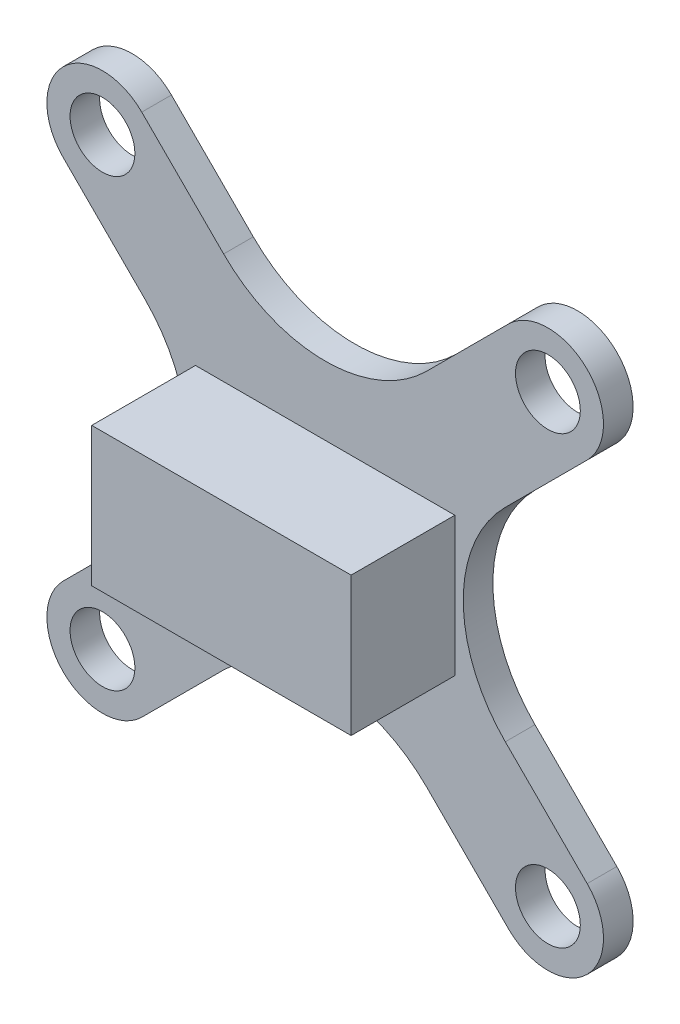
ISO-10303-21;
HEADER;
FILE_DESCRIPTION(('STEP AP214'),'2;1');
FILE_NAME('part.step','',(''),(''),'','','');
FILE_SCHEMA(('AUTOMOTIVE_DESIGN { 1 0 10303 214 1 1 1 1 }'));
ENDSEC;
DATA;
#1=APPLICATION_CONTEXT('core data for automotive mechanical design processes');
#2=APPLICATION_PROTOCOL_DEFINITION('international standard','automotive_design',2000,#1);
#3=PRODUCT_CONTEXT('',#1,'mechanical');
#4=PRODUCT('Part','Part','',(#3));
#5=PRODUCT_RELATED_PRODUCT_CATEGORY('part','',(#4));
#6=PRODUCT_DEFINITION_FORMATION('','',#4);
#7=PRODUCT_DEFINITION_CONTEXT('part definition',#1,'design');
#8=PRODUCT_DEFINITION('design','',#6,#7);
#9=PRODUCT_DEFINITION_SHAPE('','',#8);
#10=(LENGTH_UNIT() NAMED_UNIT(*) SI_UNIT(.MILLI.,.METRE.));
#11=(NAMED_UNIT(*) PLANE_ANGLE_UNIT() SI_UNIT($,.RADIAN.));
#12=(NAMED_UNIT(*) SI_UNIT($,.STERADIAN.) SOLID_ANGLE_UNIT());
#13=UNCERTAINTY_MEASURE_WITH_UNIT(LENGTH_MEASURE(1.E-05),#10,'distance_accuracy_value','');
#14=(GEOMETRIC_REPRESENTATION_CONTEXT(3) GLOBAL_UNCERTAINTY_ASSIGNED_CONTEXT((#13)) GLOBAL_UNIT_ASSIGNED_CONTEXT((#10,
#11,#12)) REPRESENTATION_CONTEXT('',''));
#15=CARTESIAN_POINT('',(0.,0.,0.));
#16=DIRECTION('',(0.,0.,1.));
#17=DIRECTION('',(1.,0.,0.));
#18=AXIS2_PLACEMENT_3D('',#15,#16,#17);
#19=CARTESIAN_POINT('',(0.,0.,0.));
#20=DIRECTION('',(0.,0.,1.));
#21=DIRECTION('',(1.,0.,0.));
#22=AXIS2_PLACEMENT_3D('',#19,#20,#21);
#23=PLANE('',#22);
#24=DIRECTION('',(-0.707106781186548,0.707106781186547,0.));
#25=VECTOR('',#24,1.);
#26=CARTESIAN_POINT('',(-2.12132034355968,-2.12132034355968,0.));
#27=LINE('',#26,#25);
#28=CARTESIAN_POINT('',(-9.72271824131501,5.48007755419564,0.));
#29=VERTEX_POINT('',#28);
#30=CARTESIAN_POINT('',(-14.142135623731,9.89949493661161,0.));
#31=VERTEX_POINT('',#30);
#32=EDGE_CURVE('E424',#29,#31,#27,.T.);
#33=ORIENTED_EDGE('',*,*,#32,.T.);
#34=CARTESIAN_POINT('',(-12.0208152801714,12.0208152801712,0.));
#35=DIRECTION('',(0.,0.,1.));
#36=DIRECTION('',(1.,0.,0.));
#37=AXIS2_PLACEMENT_3D('',#34,#35,#36);
#38=CIRCLE('',#37,3.);
#39=CARTESIAN_POINT('',(-9.89949493661172,14.1421356237309,0.));
#40=VERTEX_POINT('',#39);
#41=EDGE_CURVE('E331',#31,#40,#38,.F.);
#42=ORIENTED_EDGE('',*,*,#41,.T.);
#43=DIRECTION('',(0.70710678118655,-0.707106781186545,0.));
#44=VECTOR('',#43,1.);
#45=CARTESIAN_POINT('',(2.12132034355962,2.12132034355964,0.));
#46=LINE('',#45,#44);
#47=CARTESIAN_POINT('',(-5.48007755419572,9.72271824131494,0.));
#48=VERTEX_POINT('',#47);
#49=EDGE_CURVE('E477',#40,#48,#46,.T.);
#50=ORIENTED_EDGE('',*,*,#49,.T.);
#51=CARTESIAN_POINT('',(0.,15.2027957955107,0.));
#52=DIRECTION('',(0.,0.,1.));
#53=DIRECTION('',(1.,0.,0.));
#54=AXIS2_PLACEMENT_3D('',#51,#52,#53);
#55=CIRCLE('',#54,7.74999999999999);
#56=CARTESIAN_POINT('',(5.48007755419572,9.72271824131497,0.));
#57=VERTEX_POINT('',#56);
#58=EDGE_CURVE('E478',#48,#57,#55,.T.);
#59=ORIENTED_EDGE('',*,*,#58,.T.);
#60=DIRECTION('',(-0.707106781186555,-0.70710678118654,0.));
#61=VECTOR('',#60,1.);
#62=CARTESIAN_POINT('',(-2.12132034355968,2.12132034355973,0.));
#63=LINE('',#62,#61);
#64=CARTESIAN_POINT('',(9.89949493661175,14.1421356237309,0.));
#65=VERTEX_POINT('',#64);
#66=EDGE_CURVE('E472',#65,#57,#63,.T.);
#67=ORIENTED_EDGE('',*,*,#66,.F.);
#68=CARTESIAN_POINT('',(12.0208152801714,12.0208152801712,0.));
#69=DIRECTION('',(0.,0.,1.));
#70=DIRECTION('',(1.,0.,0.));
#71=AXIS2_PLACEMENT_3D('',#68,#69,#70);
#72=CIRCLE('',#71,3.);
#73=CARTESIAN_POINT('',(14.142135623731,9.89949493661159,0.));
#74=VERTEX_POINT('',#73);
#75=EDGE_CURVE('E470',#74,#65,#72,.T.);
#76=ORIENTED_EDGE('',*,*,#75,.F.);
#77=DIRECTION('',(0.70710678118657,0.707106781186525,0.));
#78=VECTOR('',#77,1.);
#79=CARTESIAN_POINT('',(2.12132034355925,-2.12132034355939,0.));
#80=LINE('',#79,#78);
#81=CARTESIAN_POINT('',(9.72271824131493,5.4800775541958,0.));
#82=VERTEX_POINT('',#81);
#83=EDGE_CURVE('E463',#82,#74,#80,.T.);
#84=ORIENTED_EDGE('',*,*,#83,.F.);
#85=CARTESIAN_POINT('',(15.2027957955107,1.23165366794353E-13,0.));
#86=DIRECTION('',(0.,0.,1.));
#87=DIRECTION('',(1.,0.,0.));
#88=AXIS2_PLACEMENT_3D('',#85,#86,#87);
#89=CIRCLE('',#88,7.74999999999999);
#90=CARTESIAN_POINT('',(9.72271824131501,-5.48007755419564,0.));
#91=VERTEX_POINT('',#90);
#92=EDGE_CURVE('E458',#82,#91,#89,.T.);
#93=ORIENTED_EDGE('',*,*,#92,.T.);
#94=DIRECTION('',(0.707106781186551,-0.707106781186544,0.));
#95=VECTOR('',#94,1.);
#96=CARTESIAN_POINT('',(2.12132034355964,2.12132034355966,0.));
#97=LINE('',#96,#95);
#98=CARTESIAN_POINT('',(14.142135623731,-9.89949493661159,0.));
#99=VERTEX_POINT('',#98);
#100=EDGE_CURVE('E457',#91,#99,#97,.T.);
#101=ORIENTED_EDGE('',*,*,#100,.T.);
#102=CARTESIAN_POINT('',(12.0208152801714,-12.0208152801712,0.));
#103=DIRECTION('',(0.,0.,1.));
#104=DIRECTION('',(1.,0.,0.));
#105=AXIS2_PLACEMENT_3D('',#102,#103,#104);
#106=CIRCLE('',#105,3.);
#107=CARTESIAN_POINT('',(9.89949493661175,-14.1421356237309,0.));
#108=VERTEX_POINT('',#107);
#109=EDGE_CURVE('E451',#99,#108,#106,.F.);
#110=ORIENTED_EDGE('',*,*,#109,.T.);
#111=DIRECTION('',(-0.707106781186555,0.70710678118654,0.));
#112=VECTOR('',#111,1.);
#113=CARTESIAN_POINT('',(-2.12132034355968,-2.12132034355973,0.));
#114=LINE('',#113,#112);
#115=CARTESIAN_POINT('',(5.48007755419572,-9.72271824131497,0.));
#116=VERTEX_POINT('',#115);
#117=EDGE_CURVE('E450',#108,#116,#114,.T.);
#118=ORIENTED_EDGE('',*,*,#117,.T.);
#119=CARTESIAN_POINT('',(0.,-15.2027957955107,0.));
#120=DIRECTION('',(0.,0.,1.));
#121=DIRECTION('',(1.,0.,0.));
#122=AXIS2_PLACEMENT_3D('',#119,#120,#121);
#123=CIRCLE('',#122,7.74999999999999);
#124=CARTESIAN_POINT('',(-5.48007755419571,-9.72271824131497,0.));
#125=VERTEX_POINT('',#124);
#126=EDGE_CURVE('E441',#125,#116,#123,.F.);
#127=ORIENTED_EDGE('',*,*,#126,.F.);
#128=DIRECTION('',(0.707106781186556,0.707106781186539,0.));
#129=VECTOR('',#128,1.);
#130=CARTESIAN_POINT('',(2.12132034355969,-2.12132034355975,0.));
#131=LINE('',#130,#129);
#132=CARTESIAN_POINT('',(-9.89949493661175,-14.1421356237309,0.));
#133=VERTEX_POINT('',#132);
#134=EDGE_CURVE('E439',#133,#125,#131,.T.);
#135=ORIENTED_EDGE('',*,*,#134,.F.);
#136=CARTESIAN_POINT('',(-12.0208152801714,-12.0208152801712,0.));
#137=DIRECTION('',(0.,0.,1.));
#138=DIRECTION('',(1.,0.,0.));
#139=AXIS2_PLACEMENT_3D('',#136,#137,#138);
#140=CIRCLE('',#139,3.);
#141=CARTESIAN_POINT('',(-14.142135623731,-9.89949493661159,0.));
#142=VERTEX_POINT('',#141);
#143=EDGE_CURVE('E436',#142,#133,#140,.T.);
#144=ORIENTED_EDGE('',*,*,#143,.F.);
#145=DIRECTION('',(-0.707106781186571,-0.707106781186524,0.));
#146=VECTOR('',#145,1.);
#147=CARTESIAN_POINT('',(-2.12132034355923,2.12132034355938,0.));
#148=LINE('',#147,#146);
#149=CARTESIAN_POINT('',(-9.72271824131492,-5.4800775541958,0.));
#150=VERTEX_POINT('',#149);
#151=EDGE_CURVE('E435',#150,#142,#148,.T.);
#152=ORIENTED_EDGE('',*,*,#151,.F.);
#153=CARTESIAN_POINT('',(-15.2027957955107,-1.28369537222284E-13,0.));
#154=DIRECTION('',(0.,0.,1.));
#155=DIRECTION('',(1.,0.,0.));
#156=AXIS2_PLACEMENT_3D('',#153,#154,#155);
#157=CIRCLE('',#156,7.75);
#158=EDGE_CURVE('E428',#29,#150,#157,.F.);
#159=ORIENTED_EDGE('',*,*,#158,.F.);
#160=EDGE_LOOP('',(#33,#42,#50,#59,#67,#76,#84,#93,#101,#110,#118,#127,#135,#144,#152,#159));
#161=FACE_BOUND('',#160,.T.);
#162=CARTESIAN_POINT('',(12.0208152801714,-12.0208152801712,0.));
#163=DIRECTION('',(0.,0.,1.));
#164=DIRECTION('',(1.,0.,0.));
#165=AXIS2_PLACEMENT_3D('',#162,#163,#164);
#166=CIRCLE('',#165,1.75);
#167=CARTESIAN_POINT('',(13.7708152801714,-12.0208152801712,0.));
#168=VERTEX_POINT('',#167);
#169=EDGE_CURVE('E419',#168,#168,#166,.T.);
#170=ORIENTED_EDGE('',*,*,#169,.T.);
#171=EDGE_LOOP('',(#170));
#172=FACE_BOUND('',#171,.T.);
#173=CARTESIAN_POINT('',(12.0208152801714,12.0208152801712,0.));
#174=DIRECTION('',(0.,0.,1.));
#175=DIRECTION('',(1.,0.,0.));
#176=AXIS2_PLACEMENT_3D('',#173,#174,#175);
#177=CIRCLE('',#176,1.75);
#178=CARTESIAN_POINT('',(13.7708152801714,12.0208152801712,0.));
#179=VERTEX_POINT('',#178);
#180=EDGE_CURVE('E418',#179,#179,#177,.F.);
#181=ORIENTED_EDGE('',*,*,#180,.F.);
#182=EDGE_LOOP('',(#181));
#183=FACE_BOUND('',#182,.T.);
#184=CARTESIAN_POINT('',(-12.0208152801714,12.0208152801713,0.));
#185=DIRECTION('',(0.,0.,1.));
#186=DIRECTION('',(1.,0.,0.));
#187=AXIS2_PLACEMENT_3D('',#184,#185,#186);
#188=CIRCLE('',#187,1.74999999999998);
#189=CARTESIAN_POINT('',(-10.2708152801714,12.0208152801713,0.));
#190=VERTEX_POINT('',#189);
#191=EDGE_CURVE('E411',#190,#190,#188,.T.);
#192=ORIENTED_EDGE('',*,*,#191,.T.);
#193=EDGE_LOOP('',(#192));
#194=FACE_BOUND('',#193,.T.);
#195=CARTESIAN_POINT('',(-12.0208152801714,-12.0208152801712,0.));
#196=DIRECTION('',(0.,0.,1.));
#197=DIRECTION('',(1.,0.,0.));
#198=AXIS2_PLACEMENT_3D('',#195,#196,#197);
#199=CIRCLE('',#198,1.75);
#200=CARTESIAN_POINT('',(-10.2708152801714,-12.0208152801712,0.));
#201=VERTEX_POINT('',#200);
#202=EDGE_CURVE('E327',#201,#201,#199,.F.);
#203=ORIENTED_EDGE('',*,*,#202,.F.);
#204=EDGE_LOOP('',(#203));
#205=FACE_BOUND('',#204,.T.);
#206=DIRECTION('',(0.,-1.,0.));
#207=VECTOR('',#206,1.);
#208=CARTESIAN_POINT('',(2.5,0.,0.));
#209=LINE('',#208,#207);
#210=CARTESIAN_POINT('',(2.5,2.,0.));
#211=VERTEX_POINT('',#210);
#212=CARTESIAN_POINT('',(2.5,-2.,0.));
#213=VERTEX_POINT('',#212);
#214=EDGE_CURVE('E93',#211,#213,#209,.T.);
#215=ORIENTED_EDGE('',*,*,#214,.F.);
#216=DIRECTION('',(1.,0.,0.));
#217=VECTOR('',#216,1.);
#218=CARTESIAN_POINT('',(0.,2.,0.));
#219=LINE('',#218,#217);
#220=CARTESIAN_POINT('',(-2.5,2.,0.));
#221=VERTEX_POINT('',#220);
#222=EDGE_CURVE('E252',#221,#211,#219,.T.);
#223=ORIENTED_EDGE('',*,*,#222,.F.);
#224=DIRECTION('',(0.,-1.,0.));
#225=VECTOR('',#224,1.);
#226=CARTESIAN_POINT('',(-2.5,0.,0.));
#227=LINE('',#226,#225);
#228=CARTESIAN_POINT('',(-2.5,-2.,0.));
#229=VERTEX_POINT('',#228);
#230=EDGE_CURVE('E264',#221,#229,#227,.T.);
#231=ORIENTED_EDGE('',*,*,#230,.T.);
#232=DIRECTION('',(1.,0.,0.));
#233=VECTOR('',#232,1.);
#234=CARTESIAN_POINT('',(0.,-2.,0.));
#235=LINE('',#234,#233);
#236=EDGE_CURVE('E261',#229,#213,#235,.T.);
#237=ORIENTED_EDGE('',*,*,#236,.T.);
#238=EDGE_LOOP('',(#215,#223,#231,#237));
#239=FACE_BOUND('',#238,.T.);
#240=ADVANCED_FACE('F73',(#161,#172,#183,#194,#205,#239),#23,.F.);
#241=CARTESIAN_POINT('',(-2.12132034355968,-2.12132034355968,1.6));
#242=DIRECTION('',(-0.707106781186547,-0.707106781186548,0.));
#243=DIRECTION('',(0.707106781186548,-0.707106781186547,0.));
#244=AXIS2_PLACEMENT_3D('',#241,#242,#243);
#245=PLANE('',#244);
#246=ORIENTED_EDGE('',*,*,#32,.F.);
#247=DIRECTION('',(0.,0.,-1.));
#248=VECTOR('',#247,1.);
#249=CARTESIAN_POINT('',(-9.72271824131501,5.48007755419564,1.6));
#250=LINE('',#249,#248);
#251=CARTESIAN_POINT('',(-9.72271824131501,5.48007755419564,1.6));
#252=VERTEX_POINT('',#251);
#253=EDGE_CURVE('E12',#252,#29,#250,.T.);
#254=ORIENTED_EDGE('',*,*,#253,.F.);
#255=DIRECTION('',(-0.707106781186548,0.707106781186547,0.));
#256=VECTOR('',#255,1.);
#257=CARTESIAN_POINT('',(-2.12132034355968,-2.12132034355968,1.6));
#258=LINE('',#257,#256);
#259=CARTESIAN_POINT('',(-14.142135623731,9.89949493661161,1.6));
#260=VERTEX_POINT('',#259);
#261=EDGE_CURVE('E347',#252,#260,#258,.T.);
#262=ORIENTED_EDGE('',*,*,#261,.T.);
#263=DIRECTION('',(0.,0.,-1.));
#264=VECTOR('',#263,1.);
#265=CARTESIAN_POINT('',(-14.142135623731,9.89949493661161,1.6));
#266=LINE('',#265,#264);
#267=EDGE_CURVE('E410',#260,#31,#266,.T.);
#268=ORIENTED_EDGE('',*,*,#267,.T.);
#269=EDGE_LOOP('',(#246,#254,#262,#268));
#270=FACE_BOUND('',#269,.T.);
#271=ADVANCED_FACE('F550',(#270),#245,.T.);
#272=CARTESIAN_POINT('',(-15.2027957955107,-1.28369537222284E-13,1.6));
#273=DIRECTION('',(0.,0.,-1.));
#274=DIRECTION('',(-1.,0.,0.));
#275=AXIS2_PLACEMENT_3D('',#272,#273,#274);
#276=CYLINDRICAL_SURFACE('',#275,7.75);
#277=ORIENTED_EDGE('',*,*,#158,.T.);
#278=DIRECTION('',(0.,0.,-1.));
#279=VECTOR('',#278,1.);
#280=CARTESIAN_POINT('',(-9.72271824131492,-5.4800775541958,1.6));
#281=LINE('',#280,#279);
#282=CARTESIAN_POINT('',(-9.72271824131492,-5.4800775541958,1.6));
#283=VERTEX_POINT('',#282);
#284=EDGE_CURVE('E83',#283,#150,#281,.T.);
#285=ORIENTED_EDGE('',*,*,#284,.F.);
#286=CARTESIAN_POINT('',(-15.2027957955107,-1.28369537222284E-13,1.6));
#287=DIRECTION('',(0.,0.,1.));
#288=DIRECTION('',(1.,0.,0.));
#289=AXIS2_PLACEMENT_3D('',#286,#287,#288);
#290=CIRCLE('',#289,7.75);
#291=EDGE_CURVE('E348',#252,#283,#290,.F.);
#292=ORIENTED_EDGE('',*,*,#291,.F.);
#293=ORIENTED_EDGE('',*,*,#253,.T.);
#294=EDGE_LOOP('',(#277,#285,#292,#293));
#295=FACE_BOUND('',#294,.T.);
#296=ADVANCED_FACE('F541',(#295),#276,.F.);
#297=CARTESIAN_POINT('',(-2.12132034355923,2.12132034355938,1.6));
#298=DIRECTION('',(0.707106781186524,-0.707106781186572,0.));
#299=DIRECTION('',(0.707106781186572,0.707106781186524,0.));
#300=AXIS2_PLACEMENT_3D('',#297,#298,#299);
#301=PLANE('',#300);
#302=ORIENTED_EDGE('',*,*,#151,.T.);
#303=DIRECTION('',(0.,0.,-1.));
#304=VECTOR('',#303,1.);
#305=CARTESIAN_POINT('',(-14.142135623731,-9.89949493661159,1.6));
#306=LINE('',#305,#304);
#307=CARTESIAN_POINT('',(-14.142135623731,-9.89949493661159,1.6));
#308=VERTEX_POINT('',#307);
#309=EDGE_CURVE('E530',#308,#142,#306,.T.);
#310=ORIENTED_EDGE('',*,*,#309,.F.);
#311=DIRECTION('',(-0.707106781186571,-0.707106781186524,0.));
#312=VECTOR('',#311,1.);
#313=CARTESIAN_POINT('',(-2.12132034355923,2.12132034355938,1.6));
#314=LINE('',#313,#312);
#315=EDGE_CURVE('E353',#283,#308,#314,.T.);
#316=ORIENTED_EDGE('',*,*,#315,.F.);
#317=ORIENTED_EDGE('',*,*,#284,.T.);
#318=EDGE_LOOP('',(#302,#310,#316,#317));
#319=FACE_BOUND('',#318,.T.);
#320=ADVANCED_FACE('F536',(#319),#301,.F.);
#321=CARTESIAN_POINT('',(-12.0208152801714,-12.0208152801712,1.6));
#322=DIRECTION('',(0.,0.,-1.));
#323=DIRECTION('',(-1.,0.,0.));
#324=AXIS2_PLACEMENT_3D('',#321,#322,#323);
#325=CYLINDRICAL_SURFACE('',#324,3.);
#326=ORIENTED_EDGE('',*,*,#143,.T.);
#327=DIRECTION('',(0.,0.,-1.));
#328=VECTOR('',#327,1.);
#329=CARTESIAN_POINT('',(-9.89949493661175,-14.1421356237309,1.6));
#330=LINE('',#329,#328);
#331=CARTESIAN_POINT('',(-9.89949493661175,-14.1421356237309,1.6));
#332=VERTEX_POINT('',#331);
#333=EDGE_CURVE('E522',#332,#133,#330,.T.);
#334=ORIENTED_EDGE('',*,*,#333,.F.);
#335=CARTESIAN_POINT('',(-12.0208152801714,-12.0208152801712,1.6));
#336=DIRECTION('',(0.,0.,1.));
#337=DIRECTION('',(1.,0.,0.));
#338=AXIS2_PLACEMENT_3D('',#335,#336,#337);
#339=CIRCLE('',#338,3.);
#340=EDGE_CURVE('E360',#308,#332,#339,.T.);
#341=ORIENTED_EDGE('',*,*,#340,.F.);
#342=ORIENTED_EDGE('',*,*,#309,.T.);
#343=EDGE_LOOP('',(#326,#334,#341,#342));
#344=FACE_BOUND('',#343,.T.);
#345=ADVANCED_FACE('F594',(#344),#325,.T.);
#346=CARTESIAN_POINT('',(2.12132034355969,-2.12132034355975,1.6));
#347=DIRECTION('',(-0.707106781186539,0.707106781186556,0.));
#348=DIRECTION('',(-0.707106781186556,-0.707106781186539,0.));
#349=AXIS2_PLACEMENT_3D('',#346,#347,#348);
#350=PLANE('',#349);
#351=ORIENTED_EDGE('',*,*,#134,.T.);
#352=DIRECTION('',(0.,0.,-1.));
#353=VECTOR('',#352,1.);
#354=CARTESIAN_POINT('',(-5.48007755419571,-9.72271824131497,1.6));
#355=LINE('',#354,#353);
#356=CARTESIAN_POINT('',(-5.48007755419571,-9.72271824131497,1.6));
#357=VERTEX_POINT('',#356);
#358=EDGE_CURVE('E524',#357,#125,#355,.T.);
#359=ORIENTED_EDGE('',*,*,#358,.F.);
#360=DIRECTION('',(0.707106781186556,0.707106781186539,0.));
#361=VECTOR('',#360,1.);
#362=CARTESIAN_POINT('',(2.12132034355969,-2.12132034355975,1.6));
#363=LINE('',#362,#361);
#364=EDGE_CURVE('E362',#332,#357,#363,.T.);
#365=ORIENTED_EDGE('',*,*,#364,.F.);
#366=ORIENTED_EDGE('',*,*,#333,.T.);
#367=EDGE_LOOP('',(#351,#359,#365,#366));
#368=FACE_BOUND('',#367,.T.);
#369=ADVANCED_FACE('F595',(#368),#350,.F.);
#370=CARTESIAN_POINT('',(0.,-15.2027957955107,1.6));
#371=DIRECTION('',(0.,0.,-1.));
#372=DIRECTION('',(-1.,0.,0.));
#373=AXIS2_PLACEMENT_3D('',#370,#371,#372);
#374=CYLINDRICAL_SURFACE('',#373,7.74999999999999);
#375=ORIENTED_EDGE('',*,*,#126,.T.);
#376=DIRECTION('',(0.,0.,-1.));
#377=VECTOR('',#376,1.);
#378=CARTESIAN_POINT('',(5.48007755419572,-9.72271824131497,1.6));
#379=LINE('',#378,#377);
#380=CARTESIAN_POINT('',(5.48007755419572,-9.72271824131497,1.6));
#381=VERTEX_POINT('',#380);
#382=EDGE_CURVE('E520',#381,#116,#379,.T.);
#383=ORIENTED_EDGE('',*,*,#382,.F.);
#384=CARTESIAN_POINT('',(0.,-15.2027957955107,1.6));
#385=DIRECTION('',(0.,0.,1.));
#386=DIRECTION('',(1.,0.,0.));
#387=AXIS2_PLACEMENT_3D('',#384,#385,#386);
#388=CIRCLE('',#387,7.74999999999999);
#389=EDGE_CURVE('E368',#357,#381,#388,.F.);
#390=ORIENTED_EDGE('',*,*,#389,.F.);
#391=ORIENTED_EDGE('',*,*,#358,.T.);
#392=EDGE_LOOP('',(#375,#383,#390,#391));
#393=FACE_BOUND('',#392,.T.);
#394=ADVANCED_FACE('F587',(#393),#374,.F.);
#395=CARTESIAN_POINT('',(-2.12132034355968,-2.12132034355973,1.6));
#396=DIRECTION('',(-0.70710678118654,-0.707106781186555,0.));
#397=DIRECTION('',(0.707106781186555,-0.70710678118654,0.));
#398=AXIS2_PLACEMENT_3D('',#395,#396,#397);
#399=PLANE('',#398);
#400=ORIENTED_EDGE('',*,*,#117,.F.);
#401=DIRECTION('',(0.,0.,-1.));
#402=VECTOR('',#401,1.);
#403=CARTESIAN_POINT('',(9.89949493661175,-14.1421356237309,1.6));
#404=LINE('',#403,#402);
#405=CARTESIAN_POINT('',(9.89949493661175,-14.1421356237309,1.6));
#406=VERTEX_POINT('',#405);
#407=EDGE_CURVE('E513',#406,#108,#404,.T.);
#408=ORIENTED_EDGE('',*,*,#407,.F.);
#409=DIRECTION('',(-0.707106781186555,0.70710678118654,0.));
#410=VECTOR('',#409,1.);
#411=CARTESIAN_POINT('',(-2.12132034355968,-2.12132034355973,1.6));
#412=LINE('',#411,#410);
#413=EDGE_CURVE('E369',#406,#381,#412,.T.);
#414=ORIENTED_EDGE('',*,*,#413,.T.);
#415=ORIENTED_EDGE('',*,*,#382,.T.);
#416=EDGE_LOOP('',(#400,#408,#414,#415));
#417=FACE_BOUND('',#416,.T.);
#418=ADVANCED_FACE('F588',(#417),#399,.T.);
#419=CARTESIAN_POINT('',(12.0208152801714,-12.0208152801712,1.6));
#420=DIRECTION('',(0.,0.,-1.));
#421=DIRECTION('',(-1.,0.,0.));
#422=AXIS2_PLACEMENT_3D('',#419,#420,#421);
#423=CYLINDRICAL_SURFACE('',#422,3.);
#424=ORIENTED_EDGE('',*,*,#109,.F.);
#425=DIRECTION('',(0.,0.,-1.));
#426=VECTOR('',#425,1.);
#427=CARTESIAN_POINT('',(14.142135623731,-9.89949493661159,1.6));
#428=LINE('',#427,#426);
#429=CARTESIAN_POINT('',(14.142135623731,-9.89949493661159,1.6));
#430=VERTEX_POINT('',#429);
#431=EDGE_CURVE('E515',#430,#99,#428,.T.);
#432=ORIENTED_EDGE('',*,*,#431,.F.);
#433=CARTESIAN_POINT('',(12.0208152801714,-12.0208152801712,1.6));
#434=DIRECTION('',(0.,0.,1.));
#435=DIRECTION('',(1.,0.,0.));
#436=AXIS2_PLACEMENT_3D('',#433,#434,#435);
#437=CIRCLE('',#436,3.);
#438=EDGE_CURVE('E373',#430,#406,#437,.F.);
#439=ORIENTED_EDGE('',*,*,#438,.T.);
#440=ORIENTED_EDGE('',*,*,#407,.T.);
#441=EDGE_LOOP('',(#424,#432,#439,#440));
#442=FACE_BOUND('',#441,.T.);
#443=ADVANCED_FACE('F582',(#442),#423,.T.);
#444=CARTESIAN_POINT('',(2.12132034355964,2.12132034355966,1.6));
#445=DIRECTION('',(0.707106781186544,0.707106781186551,0.));
#446=DIRECTION('',(-0.707106781186551,0.707106781186544,0.));
#447=AXIS2_PLACEMENT_3D('',#444,#445,#446);
#448=PLANE('',#447);
#449=ORIENTED_EDGE('',*,*,#100,.F.);
#450=DIRECTION('',(0.,0.,-1.));
#451=VECTOR('',#450,1.);
#452=CARTESIAN_POINT('',(9.72271824131501,-5.48007755419564,1.6));
#453=LINE('',#452,#451);
#454=CARTESIAN_POINT('',(9.72271824131501,-5.48007755419564,1.6));
#455=VERTEX_POINT('',#454);
#456=EDGE_CURVE('E508',#455,#91,#453,.T.);
#457=ORIENTED_EDGE('',*,*,#456,.F.);
#458=DIRECTION('',(0.707106781186551,-0.707106781186544,0.));
#459=VECTOR('',#458,1.);
#460=CARTESIAN_POINT('',(2.12132034355964,2.12132034355966,1.6));
#461=LINE('',#460,#459);
#462=EDGE_CURVE('E380',#455,#430,#461,.T.);
#463=ORIENTED_EDGE('',*,*,#462,.T.);
#464=ORIENTED_EDGE('',*,*,#431,.T.);
#465=EDGE_LOOP('',(#449,#457,#463,#464));
#466=FACE_BOUND('',#465,.T.);
#467=ADVANCED_FACE('F580',(#466),#448,.T.);
#468=CARTESIAN_POINT('',(15.2027957955107,1.23165366794353E-13,1.6));
#469=DIRECTION('',(0.,0.,-1.));
#470=DIRECTION('',(-1.,0.,0.));
#471=AXIS2_PLACEMENT_3D('',#468,#469,#470);
#472=CYLINDRICAL_SURFACE('',#471,7.74999999999999);
#473=ORIENTED_EDGE('',*,*,#92,.F.);
#474=DIRECTION('',(0.,0.,-1.));
#475=VECTOR('',#474,1.);
#476=CARTESIAN_POINT('',(9.72271824131493,5.4800775541958,1.6));
#477=LINE('',#476,#475);
#478=CARTESIAN_POINT('',(9.72271824131493,5.4800775541958,1.6));
#479=VERTEX_POINT('',#478);
#480=EDGE_CURVE('E509',#479,#82,#477,.T.);
#481=ORIENTED_EDGE('',*,*,#480,.F.);
#482=CARTESIAN_POINT('',(15.2027957955107,1.23165366794353E-13,1.6));
#483=DIRECTION('',(0.,0.,1.));
#484=DIRECTION('',(1.,0.,0.));
#485=AXIS2_PLACEMENT_3D('',#482,#483,#484);
#486=CIRCLE('',#485,7.74999999999999);
#487=EDGE_CURVE('E381',#479,#455,#486,.T.);
#488=ORIENTED_EDGE('',*,*,#487,.T.);
#489=ORIENTED_EDGE('',*,*,#456,.T.);
#490=EDGE_LOOP('',(#473,#481,#488,#489));
#491=FACE_BOUND('',#490,.T.);
#492=ADVANCED_FACE('F573',(#491),#472,.F.);
#493=CARTESIAN_POINT('',(2.12132034355925,-2.12132034355939,1.6));
#494=DIRECTION('',(-0.707106781186525,0.70710678118657,0.));
#495=DIRECTION('',(-0.70710678118657,-0.707106781186525,0.));
#496=AXIS2_PLACEMENT_3D('',#493,#494,#495);
#497=PLANE('',#496);
#498=ORIENTED_EDGE('',*,*,#83,.T.);
#499=DIRECTION('',(0.,0.,-1.));
#500=VECTOR('',#499,1.);
#501=CARTESIAN_POINT('',(14.142135623731,9.89949493661159,1.6));
#502=LINE('',#501,#500);
#503=CARTESIAN_POINT('',(14.142135623731,9.89949493661159,1.6));
#504=VERTEX_POINT('',#503);
#505=EDGE_CURVE('E501',#504,#74,#502,.T.);
#506=ORIENTED_EDGE('',*,*,#505,.F.);
#507=DIRECTION('',(0.70710678118657,0.707106781186525,0.));
#508=VECTOR('',#507,1.);
#509=CARTESIAN_POINT('',(2.12132034355925,-2.12132034355939,1.6));
#510=LINE('',#509,#508);
#511=EDGE_CURVE('E384',#479,#504,#510,.T.);
#512=ORIENTED_EDGE('',*,*,#511,.F.);
#513=ORIENTED_EDGE('',*,*,#480,.T.);
#514=EDGE_LOOP('',(#498,#506,#512,#513));
#515=FACE_BOUND('',#514,.T.);
#516=ADVANCED_FACE('F574',(#515),#497,.F.);
#517=CARTESIAN_POINT('',(12.0208152801714,12.0208152801712,1.6));
#518=DIRECTION('',(0.,0.,-1.));
#519=DIRECTION('',(-1.,0.,0.));
#520=AXIS2_PLACEMENT_3D('',#517,#518,#519);
#521=CYLINDRICAL_SURFACE('',#520,3.);
#522=ORIENTED_EDGE('',*,*,#75,.T.);
#523=DIRECTION('',(0.,0.,-1.));
#524=VECTOR('',#523,1.);
#525=CARTESIAN_POINT('',(9.89949493661175,14.1421356237309,1.6));
#526=LINE('',#525,#524);
#527=CARTESIAN_POINT('',(9.89949493661175,14.1421356237309,1.6));
#528=VERTEX_POINT('',#527);
#529=EDGE_CURVE('E499',#528,#65,#526,.T.);
#530=ORIENTED_EDGE('',*,*,#529,.F.);
#531=CARTESIAN_POINT('',(12.0208152801714,12.0208152801712,1.6));
#532=DIRECTION('',(0.,0.,1.));
#533=DIRECTION('',(1.,0.,0.));
#534=AXIS2_PLACEMENT_3D('',#531,#532,#533);
#535=CIRCLE('',#534,3.);
#536=EDGE_CURVE('E386',#504,#528,#535,.T.);
#537=ORIENTED_EDGE('',*,*,#536,.F.);
#538=ORIENTED_EDGE('',*,*,#505,.T.);
#539=EDGE_LOOP('',(#522,#530,#537,#538));
#540=FACE_BOUND('',#539,.T.);
#541=ADVANCED_FACE('F566',(#540),#521,.T.);
#542=CARTESIAN_POINT('',(-2.12132034355968,2.12132034355973,1.6));
#543=DIRECTION('',(0.70710678118654,-0.707106781186555,0.));
#544=DIRECTION('',(0.707106781186555,0.70710678118654,0.));
#545=AXIS2_PLACEMENT_3D('',#542,#543,#544);
#546=PLANE('',#545);
#547=ORIENTED_EDGE('',*,*,#66,.T.);
#548=DIRECTION('',(0.,0.,-1.));
#549=VECTOR('',#548,1.);
#550=CARTESIAN_POINT('',(5.48007755419572,9.72271824131497,1.6));
#551=LINE('',#550,#549);
#552=CARTESIAN_POINT('',(5.48007755419572,9.72271824131497,1.6));
#553=VERTEX_POINT('',#552);
#554=EDGE_CURVE('E494',#553,#57,#551,.T.);
#555=ORIENTED_EDGE('',*,*,#554,.F.);
#556=DIRECTION('',(-0.707106781186555,-0.70710678118654,0.));
#557=VECTOR('',#556,1.);
#558=CARTESIAN_POINT('',(-2.12132034355968,2.12132034355973,1.6));
#559=LINE('',#558,#557);
#560=EDGE_CURVE('E395',#528,#553,#559,.T.);
#561=ORIENTED_EDGE('',*,*,#560,.F.);
#562=ORIENTED_EDGE('',*,*,#529,.T.);
#563=EDGE_LOOP('',(#547,#555,#561,#562));
#564=FACE_BOUND('',#563,.T.);
#565=ADVANCED_FACE('F561',(#564),#546,.F.);
#566=CARTESIAN_POINT('',(0.,15.2027957955107,1.6));
#567=DIRECTION('',(0.,0.,-1.));
#568=DIRECTION('',(-1.,0.,0.));
#569=AXIS2_PLACEMENT_3D('',#566,#567,#568);
#570=CYLINDRICAL_SURFACE('',#569,7.74999999999999);
#571=ORIENTED_EDGE('',*,*,#58,.F.);
#572=DIRECTION('',(0.,0.,-1.));
#573=VECTOR('',#572,1.);
#574=CARTESIAN_POINT('',(-5.48007755419572,9.72271824131494,1.6));
#575=LINE('',#574,#573);
#576=CARTESIAN_POINT('',(-5.48007755419572,9.72271824131494,1.6));
#577=VERTEX_POINT('',#576);
#578=EDGE_CURVE('E495',#577,#48,#575,.T.);
#579=ORIENTED_EDGE('',*,*,#578,.F.);
#580=CARTESIAN_POINT('',(0.,15.2027957955107,1.6));
#581=DIRECTION('',(0.,0.,1.));
#582=DIRECTION('',(1.,0.,0.));
#583=AXIS2_PLACEMENT_3D('',#580,#581,#582);
#584=CIRCLE('',#583,7.74999999999999);
#585=EDGE_CURVE('E399',#577,#553,#584,.T.);
#586=ORIENTED_EDGE('',*,*,#585,.T.);
#587=ORIENTED_EDGE('',*,*,#554,.T.);
#588=EDGE_LOOP('',(#571,#579,#586,#587));
#589=FACE_BOUND('',#588,.T.);
#590=ADVANCED_FACE('F558',(#589),#570,.F.);
#591=CARTESIAN_POINT('',(2.12132034355962,2.12132034355964,1.6));
#592=DIRECTION('',(0.707106781186545,0.70710678118655,0.));
#593=DIRECTION('',(-0.70710678118655,0.707106781186545,0.));
#594=AXIS2_PLACEMENT_3D('',#591,#592,#593);
#595=PLANE('',#594);
#596=ORIENTED_EDGE('',*,*,#49,.F.);
#597=DIRECTION('',(0.,0.,-1.));
#598=VECTOR('',#597,1.);
#599=CARTESIAN_POINT('',(-9.89949493661172,14.1421356237309,1.6));
#600=LINE('',#599,#598);
#601=CARTESIAN_POINT('',(-9.89949493661172,14.1421356237309,1.6));
#602=VERTEX_POINT('',#601);
#603=EDGE_CURVE('E487',#602,#40,#600,.T.);
#604=ORIENTED_EDGE('',*,*,#603,.F.);
#605=DIRECTION('',(0.70710678118655,-0.707106781186545,0.));
#606=VECTOR('',#605,1.);
#607=CARTESIAN_POINT('',(2.12132034355962,2.12132034355964,1.6));
#608=LINE('',#607,#606);
#609=EDGE_CURVE('E397',#602,#577,#608,.T.);
#610=ORIENTED_EDGE('',*,*,#609,.T.);
#611=ORIENTED_EDGE('',*,*,#578,.T.);
#612=EDGE_LOOP('',(#596,#604,#610,#611));
#613=FACE_BOUND('',#612,.T.);
#614=ADVANCED_FACE('F553',(#613),#595,.T.);
#615=CARTESIAN_POINT('',(-12.0208152801714,12.0208152801712,1.6));
#616=DIRECTION('',(0.,0.,-1.));
#617=DIRECTION('',(-1.,0.,0.));
#618=AXIS2_PLACEMENT_3D('',#615,#616,#617);
#619=CYLINDRICAL_SURFACE('',#618,3.);
#620=ORIENTED_EDGE('',*,*,#41,.F.);
#621=ORIENTED_EDGE('',*,*,#267,.F.);
#622=CARTESIAN_POINT('',(-12.0208152801714,12.0208152801712,1.6));
#623=DIRECTION('',(0.,0.,1.));
#624=DIRECTION('',(1.,0.,0.));
#625=AXIS2_PLACEMENT_3D('',#622,#623,#624);
#626=CIRCLE('',#625,3.);
#627=EDGE_CURVE('E404',#260,#602,#626,.F.);
#628=ORIENTED_EDGE('',*,*,#627,.T.);
#629=ORIENTED_EDGE('',*,*,#603,.T.);
#630=EDGE_LOOP('',(#620,#621,#628,#629));
#631=FACE_BOUND('',#630,.T.);
#632=ADVANCED_FACE('F552',(#631),#619,.T.);
#633=CARTESIAN_POINT('',(12.0208152801714,-12.0208152801712,1.6));
#634=DIRECTION('',(0.,0.,-1.));
#635=DIRECTION('',(-1.,0.,0.));
#636=AXIS2_PLACEMENT_3D('',#633,#634,#635);
#637=CYLINDRICAL_SURFACE('',#636,1.75);
#638=CARTESIAN_POINT('',(12.0208152801714,-12.0208152801712,1.6));
#639=DIRECTION('',(0.,0.,1.));
#640=DIRECTION('',(1.,0.,0.));
#641=AXIS2_PLACEMENT_3D('',#638,#639,#640);
#642=CIRCLE('',#641,1.75);
#643=CARTESIAN_POINT('',(13.7708152801714,-12.0208152801712,1.6));
#644=VERTEX_POINT('',#643);
#645=EDGE_CURVE('E341',#644,#644,#642,.T.);
#646=ORIENTED_EDGE('',*,*,#645,.T.);
#647=EDGE_LOOP('',(#646));
#648=FACE_BOUND('',#647,.T.);
#649=ORIENTED_EDGE('',*,*,#169,.F.);
#650=EDGE_LOOP('',(#649));
#651=FACE_BOUND('',#650,.T.);
#652=ADVANCED_FACE('F622',(#648,#651),#637,.F.);
#653=CARTESIAN_POINT('',(12.0208152801714,12.0208152801712,1.6));
#654=DIRECTION('',(0.,0.,-1.));
#655=DIRECTION('',(-1.,0.,0.));
#656=AXIS2_PLACEMENT_3D('',#653,#654,#655);
#657=CYLINDRICAL_SURFACE('',#656,1.75);
#658=CARTESIAN_POINT('',(12.0208152801714,12.0208152801712,1.6));
#659=DIRECTION('',(0.,0.,1.));
#660=DIRECTION('',(1.,0.,0.));
#661=AXIS2_PLACEMENT_3D('',#658,#659,#660);
#662=CIRCLE('',#661,1.75);
#663=CARTESIAN_POINT('',(13.7708152801714,12.0208152801712,1.6));
#664=VERTEX_POINT('',#663);
#665=EDGE_CURVE('E340',#664,#664,#662,.F.);
#666=ORIENTED_EDGE('',*,*,#665,.F.);
#667=EDGE_LOOP('',(#666));
#668=FACE_BOUND('',#667,.T.);
#669=ORIENTED_EDGE('',*,*,#180,.T.);
#670=EDGE_LOOP('',(#669));
#671=FACE_BOUND('',#670,.T.);
#672=ADVANCED_FACE('F655',(#668,#671),#657,.F.);
#673=CARTESIAN_POINT('',(-12.0208152801714,12.0208152801713,1.6));
#674=DIRECTION('',(0.,0.,-1.));
#675=DIRECTION('',(-1.,0.,0.));
#676=AXIS2_PLACEMENT_3D('',#673,#674,#675);
#677=CYLINDRICAL_SURFACE('',#676,1.74999999999998);
#678=CARTESIAN_POINT('',(-12.0208152801714,12.0208152801713,1.6));
#679=DIRECTION('',(0.,0.,1.));
#680=DIRECTION('',(1.,0.,0.));
#681=AXIS2_PLACEMENT_3D('',#678,#679,#680);
#682=CIRCLE('',#681,1.74999999999998);
#683=CARTESIAN_POINT('',(-10.2708152801714,12.0208152801713,1.6));
#684=VERTEX_POINT('',#683);
#685=EDGE_CURVE('E334',#684,#684,#682,.T.);
#686=ORIENTED_EDGE('',*,*,#685,.T.);
#687=EDGE_LOOP('',(#686));
#688=FACE_BOUND('',#687,.T.);
#689=ORIENTED_EDGE('',*,*,#191,.F.);
#690=EDGE_LOOP('',(#689));
#691=FACE_BOUND('',#690,.T.);
#692=ADVANCED_FACE('F609',(#688,#691),#677,.F.);
#693=CARTESIAN_POINT('',(-12.0208152801714,-12.0208152801712,1.6));
#694=DIRECTION('',(0.,0.,-1.));
#695=DIRECTION('',(-1.,0.,0.));
#696=AXIS2_PLACEMENT_3D('',#693,#694,#695);
#697=CYLINDRICAL_SURFACE('',#696,1.75);
#698=CARTESIAN_POINT('',(-12.0208152801714,-12.0208152801712,1.6));
#699=DIRECTION('',(0.,0.,1.));
#700=DIRECTION('',(1.,0.,0.));
#701=AXIS2_PLACEMENT_3D('',#698,#699,#700);
#702=CIRCLE('',#701,1.75);
#703=CARTESIAN_POINT('',(-10.2708152801714,-12.0208152801712,1.6));
#704=VERTEX_POINT('',#703);
#705=EDGE_CURVE('E328',#704,#704,#702,.F.);
#706=ORIENTED_EDGE('',*,*,#705,.F.);
#707=EDGE_LOOP('',(#706));
#708=FACE_BOUND('',#707,.T.);
#709=ORIENTED_EDGE('',*,*,#202,.T.);
#710=EDGE_LOOP('',(#709));
#711=FACE_BOUND('',#710,.T.);
#712=ADVANCED_FACE('F76',(#708,#711),#697,.F.);
#713=CARTESIAN_POINT('',(0.,0.,1.6));
#714=DIRECTION('',(0.,0.,1.));
#715=DIRECTION('',(1.,0.,0.));
#716=AXIS2_PLACEMENT_3D('',#713,#714,#715);
#717=PLANE('',#716);
#718=DIRECTION('',(-1.,0.,0.));
#719=VECTOR('',#718,1.);
#720=CARTESIAN_POINT('',(0.,3.75,1.6));
#721=LINE('',#720,#719);
#722=CARTESIAN_POINT('',(7.,3.75,1.6));
#723=VERTEX_POINT('',#722);
#724=CARTESIAN_POINT('',(-7.,3.75,1.6));
#725=VERTEX_POINT('',#724);
#726=EDGE_CURVE('E324',#723,#725,#721,.T.);
#727=ORIENTED_EDGE('',*,*,#726,.F.);
#728=DIRECTION('',(0.,1.,0.));
#729=VECTOR('',#728,1.);
#730=CARTESIAN_POINT('',(7.,0.,1.6));
#731=LINE('',#730,#729);
#732=CARTESIAN_POINT('',(7.,-3.75,1.6));
#733=VERTEX_POINT('',#732);
#734=EDGE_CURVE('E316',#733,#723,#731,.T.);
#735=ORIENTED_EDGE('',*,*,#734,.F.);
#736=DIRECTION('',(-1.,0.,0.));
#737=VECTOR('',#736,1.);
#738=CARTESIAN_POINT('',(0.,-3.75,1.6));
#739=LINE('',#738,#737);
#740=CARTESIAN_POINT('',(-7.,-3.75,1.6));
#741=VERTEX_POINT('',#740);
#742=EDGE_CURVE('E319',#733,#741,#739,.T.);
#743=ORIENTED_EDGE('',*,*,#742,.T.);
#744=DIRECTION('',(0.,1.,0.));
#745=VECTOR('',#744,1.);
#746=CARTESIAN_POINT('',(-7.,0.,1.6));
#747=LINE('',#746,#745);
#748=EDGE_CURVE('E97',#741,#725,#747,.T.);
#749=ORIENTED_EDGE('',*,*,#748,.T.);
#750=EDGE_LOOP('',(#727,#735,#743,#749));
#751=FACE_BOUND('',#750,.T.);
#752=ORIENTED_EDGE('',*,*,#705,.T.);
#753=EDGE_LOOP('',(#752));
#754=FACE_BOUND('',#753,.T.);
#755=ORIENTED_EDGE('',*,*,#685,.F.);
#756=EDGE_LOOP('',(#755));
#757=FACE_BOUND('',#756,.T.);
#758=ORIENTED_EDGE('',*,*,#665,.T.);
#759=EDGE_LOOP('',(#758));
#760=FACE_BOUND('',#759,.T.);
#761=ORIENTED_EDGE('',*,*,#645,.F.);
#762=EDGE_LOOP('',(#761));
#763=FACE_BOUND('',#762,.T.);
#764=ORIENTED_EDGE('',*,*,#261,.F.);
#765=ORIENTED_EDGE('',*,*,#291,.T.);
#766=ORIENTED_EDGE('',*,*,#315,.T.);
#767=ORIENTED_EDGE('',*,*,#340,.T.);
#768=ORIENTED_EDGE('',*,*,#364,.T.);
#769=ORIENTED_EDGE('',*,*,#389,.T.);
#770=ORIENTED_EDGE('',*,*,#413,.F.);
#771=ORIENTED_EDGE('',*,*,#438,.F.);
#772=ORIENTED_EDGE('',*,*,#462,.F.);
#773=ORIENTED_EDGE('',*,*,#487,.F.);
#774=ORIENTED_EDGE('',*,*,#511,.T.);
#775=ORIENTED_EDGE('',*,*,#536,.T.);
#776=ORIENTED_EDGE('',*,*,#560,.T.);
#777=ORIENTED_EDGE('',*,*,#585,.F.);
#778=ORIENTED_EDGE('',*,*,#609,.F.);
#779=ORIENTED_EDGE('',*,*,#627,.F.);
#780=EDGE_LOOP('',(#764,#765,#766,#767,#768,#769,#770,#771,#772,#773,#774,#775,#776,#777,#778,#779));
#781=FACE_BOUND('',#780,.T.);
#782=ADVANCED_FACE('F600',(#751,#754,#757,#760,#763,#781),#717,.T.);
#783=CARTESIAN_POINT('',(0.,0.,7.2));
#784=DIRECTION('',(0.,0.,1.));
#785=DIRECTION('',(1.,0.,0.));
#786=AXIS2_PLACEMENT_3D('',#783,#784,#785);
#787=PLANE('',#786);
#788=DIRECTION('',(0.,-1.,0.));
#789=VECTOR('',#788,1.);
#790=CARTESIAN_POINT('',(7.,0.,7.2));
#791=LINE('',#790,#789);
#792=CARTESIAN_POINT('',(7.,3.75,7.2));
#793=VERTEX_POINT('',#792);
#794=CARTESIAN_POINT('',(7.,-3.75,7.2));
#795=VERTEX_POINT('',#794);
#796=EDGE_CURVE('E284',#793,#795,#791,.T.);
#797=ORIENTED_EDGE('',*,*,#796,.F.);
#798=DIRECTION('',(1.,0.,0.));
#799=VECTOR('',#798,1.);
#800=CARTESIAN_POINT('',(0.,3.75,7.2));
#801=LINE('',#800,#799);
#802=CARTESIAN_POINT('',(-7.,3.75,7.2));
#803=VERTEX_POINT('',#802);
#804=EDGE_CURVE('E287',#803,#793,#801,.T.);
#805=ORIENTED_EDGE('',*,*,#804,.F.);
#806=DIRECTION('',(0.,-1.,0.));
#807=VECTOR('',#806,1.);
#808=CARTESIAN_POINT('',(-7.,0.,7.2));
#809=LINE('',#808,#807);
#810=CARTESIAN_POINT('',(-7.,-3.75,7.2));
#811=VERTEX_POINT('',#810);
#812=EDGE_CURVE('E294',#803,#811,#809,.T.);
#813=ORIENTED_EDGE('',*,*,#812,.T.);
#814=DIRECTION('',(1.,0.,0.));
#815=VECTOR('',#814,1.);
#816=CARTESIAN_POINT('',(0.,-3.75,7.2));
#817=LINE('',#816,#815);
#818=EDGE_CURVE('E296',#811,#795,#817,.T.);
#819=ORIENTED_EDGE('',*,*,#818,.T.);
#820=EDGE_LOOP('',(#797,#805,#813,#819));
#821=FACE_BOUND('',#820,.T.);
#822=ADVANCED_FACE('F597',(#821),#787,.T.);
#823=CARTESIAN_POINT('',(7.,0.,7.2));
#824=DIRECTION('',(1.,0.,0.));
#825=DIRECTION('',(0.,0.,-1.));
#826=AXIS2_PLACEMENT_3D('',#823,#824,#825);
#827=PLANE('',#826);
#828=DIRECTION('',(0.,0.,-1.));
#829=VECTOR('',#828,1.);
#830=CARTESIAN_POINT('',(7.,-3.75,7.2));
#831=LINE('',#830,#829);
#832=EDGE_CURVE('E297',#795,#733,#831,.T.);
#833=ORIENTED_EDGE('',*,*,#832,.T.);
#834=ORIENTED_EDGE('',*,*,#734,.T.);
#835=DIRECTION('',(0.,0.,-1.));
#836=VECTOR('',#835,1.);
#837=CARTESIAN_POINT('',(7.,3.75,7.2));
#838=LINE('',#837,#836);
#839=EDGE_CURVE('E315',#793,#723,#838,.T.);
#840=ORIENTED_EDGE('',*,*,#839,.F.);
#841=ORIENTED_EDGE('',*,*,#796,.T.);
#842=EDGE_LOOP('',(#833,#834,#840,#841));
#843=FACE_BOUND('',#842,.T.);
#844=ADVANCED_FACE('F604',(#843),#827,.T.);
#845=CARTESIAN_POINT('',(0.,-3.75,7.2));
#846=DIRECTION('',(0.,1.,0.));
#847=DIRECTION('',(0.,0.,1.));
#848=AXIS2_PLACEMENT_3D('',#845,#846,#847);
#849=PLANE('',#848);
#850=ORIENTED_EDGE('',*,*,#742,.F.);
#851=ORIENTED_EDGE('',*,*,#832,.F.);
#852=ORIENTED_EDGE('',*,*,#818,.F.);
#853=DIRECTION('',(0.,0.,-1.));
#854=VECTOR('',#853,1.);
#855=CARTESIAN_POINT('',(-7.,-3.75,7.2));
#856=LINE('',#855,#854);
#857=EDGE_CURVE('E303',#811,#741,#856,.T.);
#858=ORIENTED_EDGE('',*,*,#857,.T.);
#859=EDGE_LOOP('',(#850,#851,#852,#858));
#860=FACE_BOUND('',#859,.T.);
#861=ADVANCED_FACE('F689',(#860),#849,.F.);
#862=CARTESIAN_POINT('',(-7.,0.,7.2));
#863=DIRECTION('',(1.,0.,0.));
#864=DIRECTION('',(0.,0.,-1.));
#865=AXIS2_PLACEMENT_3D('',#862,#863,#864);
#866=PLANE('',#865);
#867=ORIENTED_EDGE('',*,*,#748,.F.);
#868=ORIENTED_EDGE('',*,*,#857,.F.);
#869=ORIENTED_EDGE('',*,*,#812,.F.);
#870=DIRECTION('',(0.,0.,-1.));
#871=VECTOR('',#870,1.);
#872=CARTESIAN_POINT('',(-7.,3.75,7.2));
#873=LINE('',#872,#871);
#874=EDGE_CURVE('E306',#803,#725,#873,.T.);
#875=ORIENTED_EDGE('',*,*,#874,.T.);
#876=EDGE_LOOP('',(#867,#868,#869,#875));
#877=FACE_BOUND('',#876,.T.);
#878=ADVANCED_FACE('F688',(#877),#866,.F.);
#879=CARTESIAN_POINT('',(0.,3.75,7.2));
#880=DIRECTION('',(0.,1.,0.));
#881=DIRECTION('',(0.,0.,1.));
#882=AXIS2_PLACEMENT_3D('',#879,#880,#881);
#883=PLANE('',#882);
#884=ORIENTED_EDGE('',*,*,#839,.T.);
#885=ORIENTED_EDGE('',*,*,#726,.T.);
#886=ORIENTED_EDGE('',*,*,#874,.F.);
#887=ORIENTED_EDGE('',*,*,#804,.T.);
#888=EDGE_LOOP('',(#884,#885,#886,#887));
#889=FACE_BOUND('',#888,.T.);
#890=ADVANCED_FACE('F683',(#889),#883,.T.);
#891=CARTESIAN_POINT('',(2.5,0.,-1.7));
#892=DIRECTION('',(-1.,0.,0.));
#893=DIRECTION('',(0.,0.,1.));
#894=AXIS2_PLACEMENT_3D('',#891,#892,#893);
#895=PLANE('',#894);
#896=ORIENTED_EDGE('',*,*,#214,.T.);
#897=DIRECTION('',(0.,0.,1.));
#898=VECTOR('',#897,1.);
#899=CARTESIAN_POINT('',(2.5,-2.,-1.7));
#900=LINE('',#899,#898);
#901=CARTESIAN_POINT('',(2.5,-2.,-1.7));
#902=VERTEX_POINT('',#901);
#903=EDGE_CURVE('E256',#902,#213,#900,.T.);
#904=ORIENTED_EDGE('',*,*,#903,.F.);
#905=DIRECTION('',(0.,-1.,0.));
#906=VECTOR('',#905,1.);
#907=CARTESIAN_POINT('',(2.5,0.,-1.7));
#908=LINE('',#907,#906);
#909=CARTESIAN_POINT('',(2.5,2.,-1.7));
#910=VERTEX_POINT('',#909);
#911=EDGE_CURVE('E245',#910,#902,#908,.T.);
#912=ORIENTED_EDGE('',*,*,#911,.F.);
#913=DIRECTION('',(0.,0.,1.));
#914=VECTOR('',#913,1.);
#915=CARTESIAN_POINT('',(2.5,2.,-1.7));
#916=LINE('',#915,#914);
#917=EDGE_CURVE('E248',#910,#211,#916,.T.);
#918=ORIENTED_EDGE('',*,*,#917,.T.);
#919=EDGE_LOOP('',(#896,#904,#912,#918));
#920=FACE_BOUND('',#919,.T.);
#921=ADVANCED_FACE('F260',(#920),#895,.F.);
#922=CARTESIAN_POINT('',(0.,-2.,-1.7));
#923=DIRECTION('',(0.,-1.,0.));
#924=DIRECTION('',(0.,0.,-1.));
#925=AXIS2_PLACEMENT_3D('',#922,#923,#924);
#926=PLANE('',#925);
#927=ORIENTED_EDGE('',*,*,#236,.F.);
#928=DIRECTION('',(0.,0.,1.));
#929=VECTOR('',#928,1.);
#930=CARTESIAN_POINT('',(-2.5,-2.,-1.7));
#931=LINE('',#930,#929);
#932=CARTESIAN_POINT('',(-2.5,-2.,-1.7));
#933=VERTEX_POINT('',#932);
#934=EDGE_CURVE('E281',#933,#229,#931,.T.);
#935=ORIENTED_EDGE('',*,*,#934,.F.);
#936=DIRECTION('',(1.,0.,0.));
#937=VECTOR('',#936,1.);
#938=CARTESIAN_POINT('',(0.,-2.,-1.7));
#939=LINE('',#938,#937);
#940=EDGE_CURVE('E254',#933,#902,#939,.T.);
#941=ORIENTED_EDGE('',*,*,#940,.T.);
#942=ORIENTED_EDGE('',*,*,#903,.T.);
#943=EDGE_LOOP('',(#927,#935,#941,#942));
#944=FACE_BOUND('',#943,.T.);
#945=ADVANCED_FACE('F667',(#944),#926,.T.);
#946=CARTESIAN_POINT('',(-2.5,0.,-1.7));
#947=DIRECTION('',(-1.,0.,0.));
#948=DIRECTION('',(0.,-1.,0.));
#949=AXIS2_PLACEMENT_3D('',#946,#947,#948);
#950=PLANE('',#949);
#951=ORIENTED_EDGE('',*,*,#230,.F.);
#952=DIRECTION('',(0.,0.,1.));
#953=VECTOR('',#952,1.);
#954=CARTESIAN_POINT('',(-2.5,2.,-1.7));
#955=LINE('',#954,#953);
#956=CARTESIAN_POINT('',(-2.5,2.,-1.7));
#957=VERTEX_POINT('',#956);
#958=EDGE_CURVE('E255',#957,#221,#955,.T.);
#959=ORIENTED_EDGE('',*,*,#958,.F.);
#960=DIRECTION('',(0.,-1.,0.));
#961=VECTOR('',#960,1.);
#962=CARTESIAN_POINT('',(-2.5,0.,-1.7));
#963=LINE('',#962,#961);
#964=EDGE_CURVE('E242',#957,#933,#963,.T.);
#965=ORIENTED_EDGE('',*,*,#964,.T.);
#966=ORIENTED_EDGE('',*,*,#934,.T.);
#967=EDGE_LOOP('',(#951,#959,#965,#966));
#968=FACE_BOUND('',#967,.T.);
#969=ADVANCED_FACE('F671',(#968),#950,.T.);
#970=CARTESIAN_POINT('',(0.,2.,-1.7));
#971=DIRECTION('',(0.,-1.,0.));
#972=DIRECTION('',(0.,0.,-1.));
#973=AXIS2_PLACEMENT_3D('',#970,#971,#972);
#974=PLANE('',#973);
#975=ORIENTED_EDGE('',*,*,#222,.T.);
#976=ORIENTED_EDGE('',*,*,#917,.F.);
#977=DIRECTION('',(1.,0.,0.));
#978=VECTOR('',#977,1.);
#979=CARTESIAN_POINT('',(0.,2.,-1.7));
#980=LINE('',#979,#978);
#981=EDGE_CURVE('E236',#957,#910,#980,.T.);
#982=ORIENTED_EDGE('',*,*,#981,.F.);
#983=ORIENTED_EDGE('',*,*,#958,.T.);
#984=EDGE_LOOP('',(#975,#976,#982,#983));
#985=FACE_BOUND('',#984,.T.);
#986=ADVANCED_FACE('F247',(#985),#974,.F.);
#987=CARTESIAN_POINT('',(0.,0.,-1.7));
#988=DIRECTION('',(0.,0.,1.));
#989=DIRECTION('',(1.,0.,0.));
#990=AXIS2_PLACEMENT_3D('',#987,#988,#989);
#991=PLANE('',#990);
#992=ORIENTED_EDGE('',*,*,#911,.T.);
#993=ORIENTED_EDGE('',*,*,#940,.F.);
#994=ORIENTED_EDGE('',*,*,#964,.F.);
#995=ORIENTED_EDGE('',*,*,#981,.T.);
#996=EDGE_LOOP('',(#992,#993,#994,#995));
#997=FACE_BOUND('',#996,.T.);
#998=ADVANCED_FACE('F238',(#997),#991,.F.);
#999=CLOSED_SHELL('',(#240,#271,#296,#320,#345,#369,#394,#418,#443,#467,#492,#516,#541,#565,
#590,#614,#632,#652,#672,#692,#712,#782,#822,#844,#861,#878,#890,#921,#945,#969,#986,#998));
#1000=MANIFOLD_SOLID_BREP('B2',#999);
#1001=ADVANCED_BREP_SHAPE_REPRESENTATION('',(#18,#1000),#14);
#1002=SHAPE_DEFINITION_REPRESENTATION(#9,#1001);
ENDSEC;
END-ISO-10303-21;
